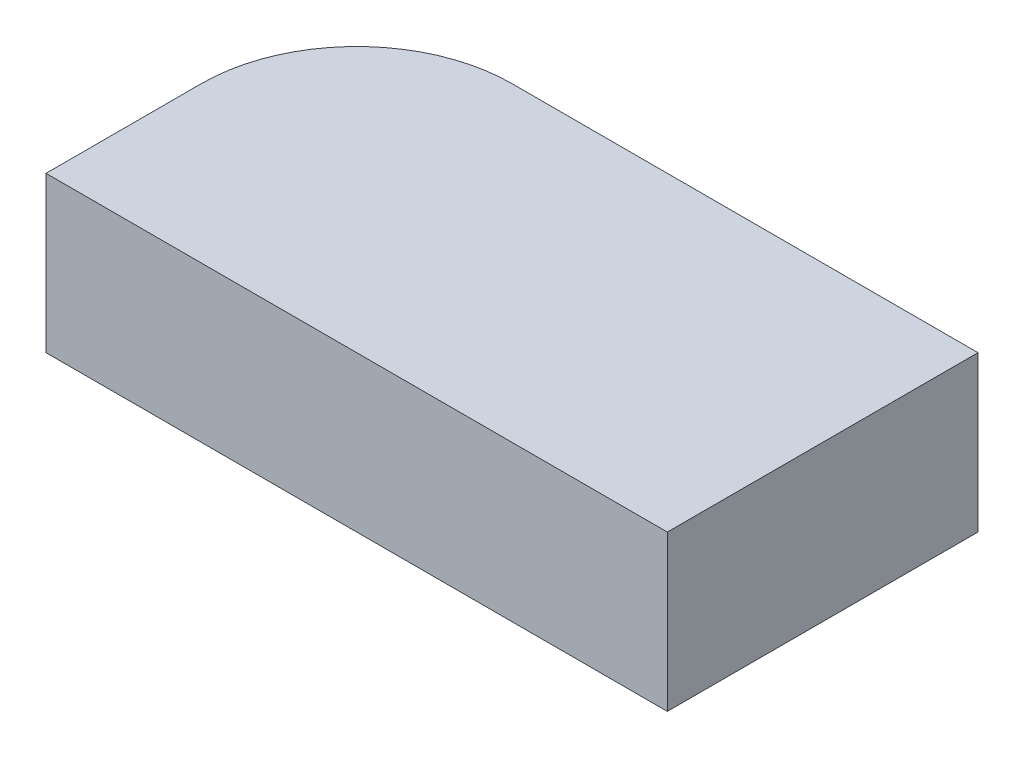
ISO-10303-21;
HEADER;
FILE_DESCRIPTION(('STEP AP214'),'2;1');
FILE_NAME('part.step','',(''),(''),'','','');
FILE_SCHEMA(('AUTOMOTIVE_DESIGN { 1 0 10303 214 1 1 1 1 }'));
ENDSEC;
DATA;
#1=APPLICATION_CONTEXT('core data for automotive mechanical design processes');
#2=APPLICATION_PROTOCOL_DEFINITION('international standard','automotive_design',2000,#1);
#3=PRODUCT_CONTEXT('',#1,'mechanical');
#4=PRODUCT('Part','Part','',(#3));
#5=PRODUCT_RELATED_PRODUCT_CATEGORY('part','',(#4));
#6=PRODUCT_DEFINITION_FORMATION('','',#4);
#7=PRODUCT_DEFINITION_CONTEXT('part definition',#1,'design');
#8=PRODUCT_DEFINITION('design','',#6,#7);
#9=PRODUCT_DEFINITION_SHAPE('','',#8);
#10=(LENGTH_UNIT() NAMED_UNIT(*) SI_UNIT(.MILLI.,.METRE.));
#11=(NAMED_UNIT(*) PLANE_ANGLE_UNIT() SI_UNIT($,.RADIAN.));
#12=(NAMED_UNIT(*) SI_UNIT($,.STERADIAN.) SOLID_ANGLE_UNIT());
#13=UNCERTAINTY_MEASURE_WITH_UNIT(LENGTH_MEASURE(1.E-05),#10,'distance_accuracy_value','');
#14=(GEOMETRIC_REPRESENTATION_CONTEXT(3) GLOBAL_UNCERTAINTY_ASSIGNED_CONTEXT((#13)) GLOBAL_UNIT_ASSIGNED_CONTEXT((#10,
#11,#12)) REPRESENTATION_CONTEXT('',''));
#15=CARTESIAN_POINT('',(0.,0.,0.));
#16=DIRECTION('',(0.,0.,1.));
#17=DIRECTION('',(1.,0.,0.));
#18=AXIS2_PLACEMENT_3D('',#15,#16,#17);
#19=CARTESIAN_POINT('',(-20.,20.,40.));
#20=DIRECTION('',(1.,0.,0.));
#21=DIRECTION('',(0.,0.,-1.));
#22=AXIS2_PLACEMENT_3D('',#19,#20,#21);
#23=PLANE('',#22);
#24=DIRECTION('',(0.,0.,1.));
#25=VECTOR('',#24,1.);
#26=CARTESIAN_POINT('',(-20.,0.,40.));
#27=LINE('',#26,#25);
#28=CARTESIAN_POINT('',(-20.,0.,20.));
#29=VERTEX_POINT('',#28);
#30=CARTESIAN_POINT('',(-20.,0.,40.));
#31=VERTEX_POINT('',#30);
#32=EDGE_CURVE('E118',#29,#31,#27,.T.);
#33=ORIENTED_EDGE('',*,*,#32,.T.);
#34=DIRECTION('',(0.,-1.,0.));
#35=VECTOR('',#34,1.);
#36=CARTESIAN_POINT('',(-20.,20.,40.));
#37=LINE('',#36,#35);
#38=CARTESIAN_POINT('',(-20.,20.,40.));
#39=VERTEX_POINT('',#38);
#40=EDGE_CURVE('E11',#39,#31,#37,.T.);
#41=ORIENTED_EDGE('',*,*,#40,.F.);
#42=DIRECTION('',(0.,0.,1.));
#43=VECTOR('',#42,1.);
#44=CARTESIAN_POINT('',(-20.,20.,40.));
#45=LINE('',#44,#43);
#46=CARTESIAN_POINT('',(-20.,20.,20.));
#47=VERTEX_POINT('',#46);
#48=EDGE_CURVE('E131',#47,#39,#45,.T.);
#49=ORIENTED_EDGE('',*,*,#48,.F.);
#50=DIRECTION('',(0.,-1.,0.));
#51=VECTOR('',#50,1.);
#52=CARTESIAN_POINT('',(-20.,20.,20.));
#53=LINE('',#52,#51);
#54=EDGE_CURVE('E114',#47,#29,#53,.T.);
#55=ORIENTED_EDGE('',*,*,#54,.T.);
#56=EDGE_LOOP('',(#33,#41,#49,#55));
#57=FACE_BOUND('',#56,.T.);
#58=ADVANCED_FACE('F39',(#57),#23,.F.);
#59=CARTESIAN_POINT('',(-20.,20.,40.));
#60=DIRECTION('',(0.,0.,-1.));
#61=DIRECTION('',(-1.,0.,0.));
#62=AXIS2_PLACEMENT_3D('',#59,#60,#61);
#63=PLANE('',#62);
#64=DIRECTION('',(1.,0.,0.));
#65=VECTOR('',#64,1.);
#66=CARTESIAN_POINT('',(-20.,0.,40.));
#67=LINE('',#66,#65);
#68=CARTESIAN_POINT('',(60.,0.,40.));
#69=VERTEX_POINT('',#68);
#70=EDGE_CURVE('E122',#31,#69,#67,.T.);
#71=ORIENTED_EDGE('',*,*,#70,.T.);
#72=DIRECTION('',(0.,-1.,0.));
#73=VECTOR('',#72,1.);
#74=CARTESIAN_POINT('',(60.,20.,40.));
#75=LINE('',#74,#73);
#76=CARTESIAN_POINT('',(60.,20.,40.));
#77=VERTEX_POINT('',#76);
#78=EDGE_CURVE('E48',#77,#69,#75,.T.);
#79=ORIENTED_EDGE('',*,*,#78,.F.);
#80=DIRECTION('',(1.,0.,0.));
#81=VECTOR('',#80,1.);
#82=CARTESIAN_POINT('',(-20.,20.,40.));
#83=LINE('',#82,#81);
#84=EDGE_CURVE('E90',#39,#77,#83,.T.);
#85=ORIENTED_EDGE('',*,*,#84,.F.);
#86=ORIENTED_EDGE('',*,*,#40,.T.);
#87=EDGE_LOOP('',(#71,#79,#85,#86));
#88=FACE_BOUND('',#87,.T.);
#89=ADVANCED_FACE('F153',(#88),#63,.F.);
#90=CARTESIAN_POINT('',(60.,20.,40.));
#91=DIRECTION('',(-1.,0.,0.));
#92=DIRECTION('',(0.,0.,1.));
#93=AXIS2_PLACEMENT_3D('',#90,#91,#92);
#94=PLANE('',#93);
#95=DIRECTION('',(0.,0.,-1.));
#96=VECTOR('',#95,1.);
#97=CARTESIAN_POINT('',(60.,0.,40.));
#98=LINE('',#97,#96);
#99=CARTESIAN_POINT('',(60.,0.,0.));
#100=VERTEX_POINT('',#99);
#101=EDGE_CURVE('E106',#69,#100,#98,.T.);
#102=ORIENTED_EDGE('',*,*,#101,.T.);
#103=DIRECTION('',(0.,-1.,0.));
#104=VECTOR('',#103,1.);
#105=CARTESIAN_POINT('',(60.,20.,0.));
#106=LINE('',#105,#104);
#107=CARTESIAN_POINT('',(60.,20.,0.));
#108=VERTEX_POINT('',#107);
#109=EDGE_CURVE('E103',#108,#100,#106,.T.);
#110=ORIENTED_EDGE('',*,*,#109,.F.);
#111=DIRECTION('',(0.,0.,-1.));
#112=VECTOR('',#111,1.);
#113=CARTESIAN_POINT('',(60.,20.,40.));
#114=LINE('',#113,#112);
#115=EDGE_CURVE('E94',#77,#108,#114,.T.);
#116=ORIENTED_EDGE('',*,*,#115,.F.);
#117=ORIENTED_EDGE('',*,*,#78,.T.);
#118=EDGE_LOOP('',(#102,#110,#116,#117));
#119=FACE_BOUND('',#118,.T.);
#120=ADVANCED_FACE('F104',(#119),#94,.F.);
#121=CARTESIAN_POINT('',(0.,20.,0.));
#122=DIRECTION('',(0.,0.,1.));
#123=DIRECTION('',(1.,0.,0.));
#124=AXIS2_PLACEMENT_3D('',#121,#122,#123);
#125=PLANE('',#124);
#126=DIRECTION('',(-1.,0.,0.));
#127=VECTOR('',#126,1.);
#128=CARTESIAN_POINT('',(0.,0.,0.));
#129=LINE('',#128,#127);
#130=CARTESIAN_POINT('',(0.,0.,0.));
#131=VERTEX_POINT('',#130);
#132=EDGE_CURVE('E76',#100,#131,#129,.T.);
#133=ORIENTED_EDGE('',*,*,#132,.T.);
#134=DIRECTION('',(0.,-1.,0.));
#135=VECTOR('',#134,1.);
#136=CARTESIAN_POINT('',(0.,20.,0.));
#137=LINE('',#136,#135);
#138=CARTESIAN_POINT('',(0.,20.,0.));
#139=VERTEX_POINT('',#138);
#140=EDGE_CURVE('E108',#139,#131,#137,.T.);
#141=ORIENTED_EDGE('',*,*,#140,.F.);
#142=DIRECTION('',(-1.,0.,0.));
#143=VECTOR('',#142,1.);
#144=CARTESIAN_POINT('',(0.,20.,0.));
#145=LINE('',#144,#143);
#146=EDGE_CURVE('E98',#108,#139,#145,.T.);
#147=ORIENTED_EDGE('',*,*,#146,.F.);
#148=ORIENTED_EDGE('',*,*,#109,.T.);
#149=EDGE_LOOP('',(#133,#141,#147,#148));
#150=FACE_BOUND('',#149,.T.);
#151=ADVANCED_FACE('F110',(#150),#125,.F.);
#152=CARTESIAN_POINT('',(0.,20.,20.));
#153=DIRECTION('',(0.,-1.,0.));
#154=DIRECTION('',(0.,0.,-1.));
#155=AXIS2_PLACEMENT_3D('',#152,#153,#154);
#156=CYLINDRICAL_SURFACE('',#155,20.);
#157=CARTESIAN_POINT('',(0.,0.,20.));
#158=DIRECTION('',(0.,1.,0.));
#159=DIRECTION('',(0.,0.,-1.));
#160=AXIS2_PLACEMENT_3D('',#157,#158,#159);
#161=CIRCLE('',#160,20.);
#162=EDGE_CURVE('E82',#131,#29,#161,.T.);
#163=ORIENTED_EDGE('',*,*,#162,.T.);
#164=ORIENTED_EDGE('',*,*,#54,.F.);
#165=CARTESIAN_POINT('',(0.,20.,20.));
#166=DIRECTION('',(0.,1.,0.));
#167=DIRECTION('',(0.,0.,-1.));
#168=AXIS2_PLACEMENT_3D('',#165,#166,#167);
#169=CIRCLE('',#168,20.);
#170=EDGE_CURVE('E56',#139,#47,#169,.T.);
#171=ORIENTED_EDGE('',*,*,#170,.F.);
#172=ORIENTED_EDGE('',*,*,#140,.T.);
#173=EDGE_LOOP('',(#163,#164,#171,#172));
#174=FACE_BOUND('',#173,.T.);
#175=ADVANCED_FACE('F142',(#174),#156,.T.);
#176=CARTESIAN_POINT('',(0.,20.,20.));
#177=DIRECTION('',(0.,-1.,0.));
#178=DIRECTION('',(0.,0.,-1.));
#179=AXIS2_PLACEMENT_3D('',#176,#177,#178);
#180=PLANE('',#179);
#181=ORIENTED_EDGE('',*,*,#48,.T.);
#182=ORIENTED_EDGE('',*,*,#84,.T.);
#183=ORIENTED_EDGE('',*,*,#115,.T.);
#184=ORIENTED_EDGE('',*,*,#146,.T.);
#185=ORIENTED_EDGE('',*,*,#170,.T.);
#186=EDGE_LOOP('',(#181,#182,#183,#184,#185));
#187=FACE_BOUND('',#186,.T.);
#188=ADVANCED_FACE('F96',(#187),#180,.F.);
#189=CARTESIAN_POINT('',(0.,0.,20.));
#190=DIRECTION('',(0.,-1.,0.));
#191=DIRECTION('',(0.,0.,-1.));
#192=AXIS2_PLACEMENT_3D('',#189,#190,#191);
#193=PLANE('',#192);
#194=ORIENTED_EDGE('',*,*,#32,.F.);
#195=ORIENTED_EDGE('',*,*,#162,.F.);
#196=ORIENTED_EDGE('',*,*,#132,.F.);
#197=ORIENTED_EDGE('',*,*,#101,.F.);
#198=ORIENTED_EDGE('',*,*,#70,.F.);
#199=EDGE_LOOP('',(#194,#195,#196,#197,#198));
#200=FACE_BOUND('',#199,.T.);
#201=ADVANCED_FACE('F138',(#200),#193,.T.);
#202=CLOSED_SHELL('',(#58,#89,#120,#151,#175,#188,#201));
#203=MANIFOLD_SOLID_BREP('B2',#202);
#204=ADVANCED_BREP_SHAPE_REPRESENTATION('',(#18,#203),#14);
#205=SHAPE_DEFINITION_REPRESENTATION(#9,#204);
ENDSEC;
END-ISO-10303-21;
